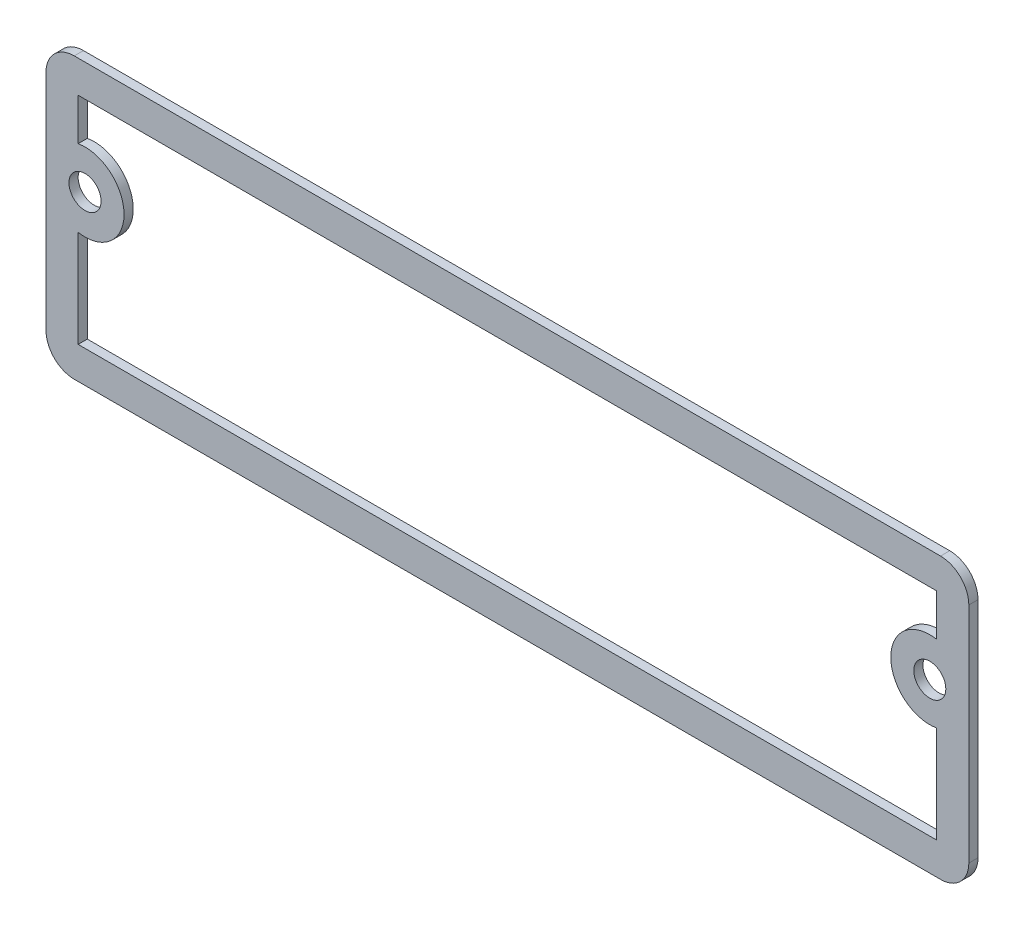
ISO-10303-21;
HEADER;
FILE_DESCRIPTION(('STEP AP214'),'2;1');
FILE_NAME('part.step','',(''),(''),'','','');
FILE_SCHEMA(('AUTOMOTIVE_DESIGN { 1 0 10303 214 1 1 1 1 }'));
ENDSEC;
DATA;
#1=APPLICATION_CONTEXT('core data for automotive mechanical design processes');
#2=APPLICATION_PROTOCOL_DEFINITION('international standard','automotive_design',2000,#1);
#3=PRODUCT_CONTEXT('',#1,'mechanical');
#4=PRODUCT('Part','Part','',(#3));
#5=PRODUCT_RELATED_PRODUCT_CATEGORY('part','',(#4));
#6=PRODUCT_DEFINITION_FORMATION('','',#4);
#7=PRODUCT_DEFINITION_CONTEXT('part definition',#1,'design');
#8=PRODUCT_DEFINITION('design','',#6,#7);
#9=PRODUCT_DEFINITION_SHAPE('','',#8);
#10=(LENGTH_UNIT() NAMED_UNIT(*) SI_UNIT(.MILLI.,.METRE.));
#11=(NAMED_UNIT(*) PLANE_ANGLE_UNIT() SI_UNIT($,.RADIAN.));
#12=(NAMED_UNIT(*) SI_UNIT($,.STERADIAN.) SOLID_ANGLE_UNIT());
#13=UNCERTAINTY_MEASURE_WITH_UNIT(LENGTH_MEASURE(1.E-05),#10,'distance_accuracy_value','');
#14=(GEOMETRIC_REPRESENTATION_CONTEXT(3) GLOBAL_UNCERTAINTY_ASSIGNED_CONTEXT((#13)) GLOBAL_UNIT_ASSIGNED_CONTEXT((#10,
#11,#12)) REPRESENTATION_CONTEXT('',''));
#15=CARTESIAN_POINT('',(0.,0.,0.));
#16=DIRECTION('',(0.,0.,1.));
#17=DIRECTION('',(1.,0.,0.));
#18=AXIS2_PLACEMENT_3D('',#15,#16,#17);
#19=CARTESIAN_POINT('',(-3.,3.,1.));
#20=DIRECTION('',(0.,0.,1.));
#21=DIRECTION('',(1.,0.,0.));
#22=AXIS2_PLACEMENT_3D('',#19,#20,#21);
#23=PLANE('',#22);
#24=CARTESIAN_POINT('',(-96.,18.,1.));
#25=DIRECTION('',(0.,0.,1.));
#26=DIRECTION('',(1.,0.,0.));
#27=AXIS2_PLACEMENT_3D('',#24,#25,#26);
#28=CIRCLE('',#27,1.75);
#29=CARTESIAN_POINT('',(-94.25,18.,1.));
#30=VERTEX_POINT('',#29);
#31=EDGE_CURVE('E11',#30,#30,#28,.T.);
#32=ORIENTED_EDGE('',*,*,#31,.F.);
#33=EDGE_LOOP('',(#32));
#34=FACE_BOUND('',#33,.T.);
#35=CARTESIAN_POINT('',(-4.,18.,1.));
#36=DIRECTION('',(0.,0.,1.));
#37=DIRECTION('',(1.,0.,0.));
#38=AXIS2_PLACEMENT_3D('',#35,#36,#37);
#39=CIRCLE('',#38,1.74409830639486);
#40=CARTESIAN_POINT('',(-2.25590169360514,18.,1.));
#41=VERTEX_POINT('',#40);
#42=EDGE_CURVE('E264',#41,#41,#39,.T.);
#43=ORIENTED_EDGE('',*,*,#42,.F.);
#44=EDGE_LOOP('',(#43));
#45=FACE_BOUND('',#44,.T.);
#46=CARTESIAN_POINT('',(-96.,18.,1.));
#47=DIRECTION('',(0.,0.,-1.));
#48=DIRECTION('',(-1.,0.,0.));
#49=AXIS2_PLACEMENT_3D('',#46,#47,#48);
#50=CIRCLE('',#49,4.25);
#51=CARTESIAN_POINT('',(-96.75,22.1833001326704,1.));
#52=VERTEX_POINT('',#51);
#53=CARTESIAN_POINT('',(-96.75,13.8166998673296,1.));
#54=VERTEX_POINT('',#53);
#55=EDGE_CURVE('E154',#52,#54,#50,.T.);
#56=ORIENTED_EDGE('',*,*,#55,.F.);
#57=DIRECTION('',(0.,-1.,0.));
#58=VECTOR('',#57,1.);
#59=CARTESIAN_POINT('',(-96.75,26.75,1.));
#60=LINE('',#59,#58);
#61=CARTESIAN_POINT('',(-96.75,26.75,1.));
#62=VERTEX_POINT('',#61);
#63=EDGE_CURVE('E160',#62,#52,#60,.T.);
#64=ORIENTED_EDGE('',*,*,#63,.F.);
#65=DIRECTION('',(-1.,0.,0.));
#66=VECTOR('',#65,1.);
#67=CARTESIAN_POINT('',(-96.75,26.75,1.));
#68=LINE('',#67,#66);
#69=CARTESIAN_POINT('',(-3.25,26.75,1.));
#70=VERTEX_POINT('',#69);
#71=EDGE_CURVE('E179',#70,#62,#68,.T.);
#72=ORIENTED_EDGE('',*,*,#71,.F.);
#73=DIRECTION('',(0.,1.,0.));
#74=VECTOR('',#73,1.);
#75=CARTESIAN_POINT('',(-3.25,26.75,1.));
#76=LINE('',#75,#74);
#77=CARTESIAN_POINT('',(-3.25,22.1833001326704,1.));
#78=VERTEX_POINT('',#77);
#79=EDGE_CURVE('E176',#78,#70,#76,.T.);
#80=ORIENTED_EDGE('',*,*,#79,.F.);
#81=CARTESIAN_POINT('',(-4.,18.,1.));
#82=DIRECTION('',(0.,0.,-1.));
#83=DIRECTION('',(1.,0.,0.));
#84=AXIS2_PLACEMENT_3D('',#81,#82,#83);
#85=CIRCLE('',#84,4.25);
#86=CARTESIAN_POINT('',(-3.25,13.8166998673296,1.));
#87=VERTEX_POINT('',#86);
#88=EDGE_CURVE('E173',#87,#78,#85,.T.);
#89=ORIENTED_EDGE('',*,*,#88,.F.);
#90=DIRECTION('',(0.,1.,0.));
#91=VECTOR('',#90,1.);
#92=CARTESIAN_POINT('',(-3.25,13.8166998673296,1.));
#93=LINE('',#92,#91);
#94=CARTESIAN_POINT('',(-3.25,3.25,1.));
#95=VERTEX_POINT('',#94);
#96=EDGE_CURVE('E167',#95,#87,#93,.T.);
#97=ORIENTED_EDGE('',*,*,#96,.F.);
#98=DIRECTION('',(1.,0.,0.));
#99=VECTOR('',#98,1.);
#100=CARTESIAN_POINT('',(-96.75,3.25,1.));
#101=LINE('',#100,#99);
#102=CARTESIAN_POINT('',(-96.75,3.25,1.));
#103=VERTEX_POINT('',#102);
#104=EDGE_CURVE('E165',#103,#95,#101,.T.);
#105=ORIENTED_EDGE('',*,*,#104,.F.);
#106=DIRECTION('',(0.,-1.,0.));
#107=VECTOR('',#106,1.);
#108=CARTESIAN_POINT('',(-96.75,13.8166998673296,1.));
#109=LINE('',#108,#107);
#110=EDGE_CURVE('E147',#54,#103,#109,.T.);
#111=ORIENTED_EDGE('',*,*,#110,.F.);
#112=EDGE_LOOP('',(#56,#64,#72,#80,#89,#97,#105,#111));
#113=FACE_BOUND('',#112,.T.);
#114=CARTESIAN_POINT('',(-2.82845920577944,27.1715407942206,1.));
#115=DIRECTION('',(0.,0.,1.));
#116=DIRECTION('',(-1.,0.,0.));
#117=AXIS2_PLACEMENT_3D('',#114,#115,#116);
#118=CIRCLE('',#117,3.07845920577944);
#119=CARTESIAN_POINT('',(0.249999999999999,27.1715407942206,1.));
#120=VERTEX_POINT('',#119);
#121=CARTESIAN_POINT('',(-2.82845920577944,30.25,1.));
#122=VERTEX_POINT('',#121);
#123=EDGE_CURVE('E184',#120,#122,#118,.T.);
#124=ORIENTED_EDGE('',*,*,#123,.T.);
#125=DIRECTION('',(-1.,0.,0.));
#126=VECTOR('',#125,1.);
#127=CARTESIAN_POINT('',(-97.1715407942206,30.25,1.));
#128=LINE('',#127,#126);
#129=CARTESIAN_POINT('',(-97.1715407942206,30.25,1.));
#130=VERTEX_POINT('',#129);
#131=EDGE_CURVE('E197',#122,#130,#128,.T.);
#132=ORIENTED_EDGE('',*,*,#131,.T.);
#133=CARTESIAN_POINT('',(-97.1715407942206,27.1715407942206,1.));
#134=DIRECTION('',(0.,0.,1.));
#135=DIRECTION('',(-1.,0.,0.));
#136=AXIS2_PLACEMENT_3D('',#133,#134,#135);
#137=CIRCLE('',#136,3.07845920577944);
#138=CARTESIAN_POINT('',(-100.25,27.1715407942206,1.));
#139=VERTEX_POINT('',#138);
#140=EDGE_CURVE('E200',#130,#139,#137,.T.);
#141=ORIENTED_EDGE('',*,*,#140,.T.);
#142=DIRECTION('',(0.,-1.,0.));
#143=VECTOR('',#142,1.);
#144=CARTESIAN_POINT('',(-100.25,27.1715407942206,1.));
#145=LINE('',#144,#143);
#146=CARTESIAN_POINT('',(-100.25,2.82845920577944,1.));
#147=VERTEX_POINT('',#146);
#148=EDGE_CURVE('E203',#139,#147,#145,.T.);
#149=ORIENTED_EDGE('',*,*,#148,.T.);
#150=CARTESIAN_POINT('',(-97.1715407942206,2.82845920577944,1.));
#151=DIRECTION('',(0.,0.,1.));
#152=DIRECTION('',(-1.,0.,0.));
#153=AXIS2_PLACEMENT_3D('',#150,#151,#152);
#154=CIRCLE('',#153,3.07845920577944);
#155=CARTESIAN_POINT('',(-97.1715407942206,-0.250000000000003,1.));
#156=VERTEX_POINT('',#155);
#157=EDGE_CURVE('E206',#147,#156,#154,.T.);
#158=ORIENTED_EDGE('',*,*,#157,.T.);
#159=DIRECTION('',(1.,0.,0.));
#160=VECTOR('',#159,1.);
#161=CARTESIAN_POINT('',(-97.1715407942206,-0.250000000000002,1.));
#162=LINE('',#161,#160);
#163=CARTESIAN_POINT('',(-2.82845920577944,-0.250000000000002,1.));
#164=VERTEX_POINT('',#163);
#165=EDGE_CURVE('E209',#156,#164,#162,.T.);
#166=ORIENTED_EDGE('',*,*,#165,.T.);
#167=CARTESIAN_POINT('',(-2.82845920577944,2.82845920577944,1.));
#168=DIRECTION('',(0.,0.,1.));
#169=DIRECTION('',(1.,0.,0.));
#170=AXIS2_PLACEMENT_3D('',#167,#168,#169);
#171=CIRCLE('',#170,3.07845920577944);
#172=CARTESIAN_POINT('',(0.249999999999999,2.82845920577944,1.));
#173=VERTEX_POINT('',#172);
#174=EDGE_CURVE('E212',#164,#173,#171,.T.);
#175=ORIENTED_EDGE('',*,*,#174,.T.);
#176=DIRECTION('',(0.,1.,0.));
#177=VECTOR('',#176,1.);
#178=CARTESIAN_POINT('',(0.249999999999999,27.1715407942206,1.));
#179=LINE('',#178,#177);
#180=EDGE_CURVE('E215',#173,#120,#179,.T.);
#181=ORIENTED_EDGE('',*,*,#180,.T.);
#182=EDGE_LOOP('',(#124,#132,#141,#149,#158,#166,#175,#181));
#183=FACE_BOUND('',#182,.T.);
#184=ADVANCED_FACE('F32',(#34,#45,#113,#183),#23,.T.);
#185=CARTESIAN_POINT('',(-3.,3.,0.));
#186=DIRECTION('',(0.,0.,1.));
#187=DIRECTION('',(1.,0.,0.));
#188=AXIS2_PLACEMENT_3D('',#185,#186,#187);
#189=PLANE('',#188);
#190=CARTESIAN_POINT('',(-96.,18.,0.));
#191=DIRECTION('',(0.,0.,1.));
#192=DIRECTION('',(1.,0.,0.));
#193=AXIS2_PLACEMENT_3D('',#190,#191,#192);
#194=CIRCLE('',#193,1.75);
#195=CARTESIAN_POINT('',(-94.25,18.,0.));
#196=VERTEX_POINT('',#195);
#197=EDGE_CURVE('E36',#196,#196,#194,.T.);
#198=ORIENTED_EDGE('',*,*,#197,.T.);
#199=EDGE_LOOP('',(#198));
#200=FACE_BOUND('',#199,.T.);
#201=CARTESIAN_POINT('',(-4.,18.,0.));
#202=DIRECTION('',(0.,0.,1.));
#203=DIRECTION('',(1.,0.,0.));
#204=AXIS2_PLACEMENT_3D('',#201,#202,#203);
#205=CIRCLE('',#204,1.74409830639486);
#206=CARTESIAN_POINT('',(-2.25590169360514,18.,0.));
#207=VERTEX_POINT('',#206);
#208=EDGE_CURVE('E234',#207,#207,#205,.F.);
#209=ORIENTED_EDGE('',*,*,#208,.F.);
#210=EDGE_LOOP('',(#209));
#211=FACE_BOUND('',#210,.T.);
#212=CARTESIAN_POINT('',(-96.,18.,0.));
#213=DIRECTION('',(0.,0.,1.));
#214=DIRECTION('',(1.,0.,0.));
#215=AXIS2_PLACEMENT_3D('',#212,#213,#214);
#216=CIRCLE('',#215,4.25);
#217=CARTESIAN_POINT('',(-96.75,13.8166998673296,0.));
#218=VERTEX_POINT('',#217);
#219=CARTESIAN_POINT('',(-96.75,22.1833001326704,0.));
#220=VERTEX_POINT('',#219);
#221=EDGE_CURVE('E47',#218,#220,#216,.T.);
#222=ORIENTED_EDGE('',*,*,#221,.F.);
#223=DIRECTION('',(0.,1.,0.));
#224=VECTOR('',#223,1.);
#225=CARTESIAN_POINT('',(-96.75,13.8166998673296,0.));
#226=LINE('',#225,#224);
#227=CARTESIAN_POINT('',(-96.75,3.25,0.));
#228=VERTEX_POINT('',#227);
#229=EDGE_CURVE('E51',#228,#218,#226,.T.);
#230=ORIENTED_EDGE('',*,*,#229,.F.);
#231=DIRECTION('',(-1.,0.,0.));
#232=VECTOR('',#231,1.);
#233=CARTESIAN_POINT('',(-96.75,3.25,0.));
#234=LINE('',#233,#232);
#235=CARTESIAN_POINT('',(-3.25,3.25,0.));
#236=VERTEX_POINT('',#235);
#237=EDGE_CURVE('E244',#236,#228,#234,.T.);
#238=ORIENTED_EDGE('',*,*,#237,.F.);
#239=DIRECTION('',(0.,-1.,0.));
#240=VECTOR('',#239,1.);
#241=CARTESIAN_POINT('',(-3.25,13.8166998673296,0.));
#242=LINE('',#241,#240);
#243=CARTESIAN_POINT('',(-3.25,13.8166998673296,0.));
#244=VERTEX_POINT('',#243);
#245=EDGE_CURVE('E291',#244,#236,#242,.T.);
#246=ORIENTED_EDGE('',*,*,#245,.F.);
#247=CARTESIAN_POINT('',(-4.,18.,0.));
#248=DIRECTION('',(0.,0.,1.));
#249=DIRECTION('',(1.,0.,0.));
#250=AXIS2_PLACEMENT_3D('',#247,#248,#249);
#251=CIRCLE('',#250,4.25);
#252=CARTESIAN_POINT('',(-3.25,22.1833001326704,0.));
#253=VERTEX_POINT('',#252);
#254=EDGE_CURVE('E296',#253,#244,#251,.T.);
#255=ORIENTED_EDGE('',*,*,#254,.F.);
#256=DIRECTION('',(0.,-1.,0.));
#257=VECTOR('',#256,1.);
#258=CARTESIAN_POINT('',(-3.25,26.75,0.));
#259=LINE('',#258,#257);
#260=CARTESIAN_POINT('',(-3.25,26.75,0.));
#261=VERTEX_POINT('',#260);
#262=EDGE_CURVE('E282',#261,#253,#259,.T.);
#263=ORIENTED_EDGE('',*,*,#262,.F.);
#264=DIRECTION('',(1.,0.,0.));
#265=VECTOR('',#264,1.);
#266=CARTESIAN_POINT('',(-96.75,26.75,0.));
#267=LINE('',#266,#265);
#268=CARTESIAN_POINT('',(-96.75,26.75,0.));
#269=VERTEX_POINT('',#268);
#270=EDGE_CURVE('E277',#269,#261,#267,.T.);
#271=ORIENTED_EDGE('',*,*,#270,.F.);
#272=DIRECTION('',(0.,1.,0.));
#273=VECTOR('',#272,1.);
#274=CARTESIAN_POINT('',(-96.75,26.75,0.));
#275=LINE('',#274,#273);
#276=EDGE_CURVE('E248',#220,#269,#275,.T.);
#277=ORIENTED_EDGE('',*,*,#276,.F.);
#278=EDGE_LOOP('',(#222,#230,#238,#246,#255,#263,#271,#277));
#279=FACE_BOUND('',#278,.T.);
#280=CARTESIAN_POINT('',(-2.82845920577944,27.1715407942206,0.));
#281=DIRECTION('',(0.,0.,1.));
#282=DIRECTION('',(1.,0.,0.));
#283=AXIS2_PLACEMENT_3D('',#280,#281,#282);
#284=CIRCLE('',#283,3.07845920577944);
#285=CARTESIAN_POINT('',(-2.82845920577944,30.25,0.));
#286=VERTEX_POINT('',#285);
#287=CARTESIAN_POINT('',(0.249999999999999,27.1715407942206,0.));
#288=VERTEX_POINT('',#287);
#289=EDGE_CURVE('E262',#286,#288,#284,.F.);
#290=ORIENTED_EDGE('',*,*,#289,.T.);
#291=DIRECTION('',(0.,-1.,0.));
#292=VECTOR('',#291,1.);
#293=CARTESIAN_POINT('',(0.249999999999999,27.1715407942206,0.));
#294=LINE('',#293,#292);
#295=CARTESIAN_POINT('',(0.249999999999999,2.82845920577944,0.));
#296=VERTEX_POINT('',#295);
#297=EDGE_CURVE('E260',#288,#296,#294,.T.);
#298=ORIENTED_EDGE('',*,*,#297,.T.);
#299=CARTESIAN_POINT('',(-2.82845920577944,2.82845920577944,0.));
#300=DIRECTION('',(0.,0.,1.));
#301=DIRECTION('',(1.,0.,0.));
#302=AXIS2_PLACEMENT_3D('',#299,#300,#301);
#303=CIRCLE('',#302,3.07845920577944);
#304=CARTESIAN_POINT('',(-2.82845920577944,-0.250000000000002,0.));
#305=VERTEX_POINT('',#304);
#306=EDGE_CURVE('E258',#296,#305,#303,.F.);
#307=ORIENTED_EDGE('',*,*,#306,.T.);
#308=DIRECTION('',(-1.,0.,0.));
#309=VECTOR('',#308,1.);
#310=CARTESIAN_POINT('',(-97.1715407942206,-0.250000000000002,0.));
#311=LINE('',#310,#309);
#312=CARTESIAN_POINT('',(-97.1715407942206,-0.250000000000003,0.));
#313=VERTEX_POINT('',#312);
#314=EDGE_CURVE('E256',#305,#313,#311,.T.);
#315=ORIENTED_EDGE('',*,*,#314,.T.);
#316=CARTESIAN_POINT('',(-97.1715407942206,2.82845920577944,0.));
#317=DIRECTION('',(0.,0.,1.));
#318=DIRECTION('',(1.,0.,0.));
#319=AXIS2_PLACEMENT_3D('',#316,#317,#318);
#320=CIRCLE('',#319,3.07845920577944);
#321=CARTESIAN_POINT('',(-100.25,2.82845920577944,0.));
#322=VERTEX_POINT('',#321);
#323=EDGE_CURVE('E254',#313,#322,#320,.F.);
#324=ORIENTED_EDGE('',*,*,#323,.T.);
#325=DIRECTION('',(0.,1.,0.));
#326=VECTOR('',#325,1.);
#327=CARTESIAN_POINT('',(-100.25,27.1715407942206,0.));
#328=LINE('',#327,#326);
#329=CARTESIAN_POINT('',(-100.25,27.1715407942206,0.));
#330=VERTEX_POINT('',#329);
#331=EDGE_CURVE('E252',#322,#330,#328,.T.);
#332=ORIENTED_EDGE('',*,*,#331,.T.);
#333=CARTESIAN_POINT('',(-97.1715407942206,27.1715407942206,0.));
#334=DIRECTION('',(0.,0.,1.));
#335=DIRECTION('',(1.,0.,0.));
#336=AXIS2_PLACEMENT_3D('',#333,#334,#335);
#337=CIRCLE('',#336,3.07845920577944);
#338=CARTESIAN_POINT('',(-97.1715407942206,30.25,0.));
#339=VERTEX_POINT('',#338);
#340=EDGE_CURVE('E250',#330,#339,#337,.F.);
#341=ORIENTED_EDGE('',*,*,#340,.T.);
#342=DIRECTION('',(1.,0.,0.));
#343=VECTOR('',#342,1.);
#344=CARTESIAN_POINT('',(-97.1715407942206,30.25,0.));
#345=LINE('',#344,#343);
#346=EDGE_CURVE('E236',#339,#286,#345,.T.);
#347=ORIENTED_EDGE('',*,*,#346,.T.);
#348=EDGE_LOOP('',(#290,#298,#307,#315,#324,#332,#341,#347));
#349=FACE_BOUND('',#348,.T.);
#350=ADVANCED_FACE('F34',(#200,#211,#279,#349),#189,.F.);
#351=CARTESIAN_POINT('',(-96.,18.,1.));
#352=DIRECTION('',(0.,0.,-1.));
#353=DIRECTION('',(-1.,0.,0.));
#354=AXIS2_PLACEMENT_3D('',#351,#352,#353);
#355=CYLINDRICAL_SURFACE('',#354,1.75);
#356=ORIENTED_EDGE('',*,*,#31,.T.);
#357=EDGE_LOOP('',(#356));
#358=FACE_BOUND('',#357,.T.);
#359=ORIENTED_EDGE('',*,*,#197,.F.);
#360=EDGE_LOOP('',(#359));
#361=FACE_BOUND('',#360,.T.);
#362=ADVANCED_FACE('F302',(#358,#361),#355,.F.);
#363=CARTESIAN_POINT('',(-4.,18.,-105.026187210619));
#364=DIRECTION('',(0.,0.,1.));
#365=DIRECTION('',(1.,0.,0.));
#366=AXIS2_PLACEMENT_3D('',#363,#364,#365);
#367=CYLINDRICAL_SURFACE('',#366,1.74409830639486);
#368=ORIENTED_EDGE('',*,*,#208,.T.);
#369=EDGE_LOOP('',(#368));
#370=FACE_BOUND('',#369,.T.);
#371=ORIENTED_EDGE('',*,*,#42,.T.);
#372=EDGE_LOOP('',(#371));
#373=FACE_BOUND('',#372,.T.);
#374=ADVANCED_FACE('F359',(#370,#373),#367,.F.);
#375=CARTESIAN_POINT('',(-96.75,26.75,-105.026187210619));
#376=DIRECTION('',(-1.,0.,0.));
#377=DIRECTION('',(0.,0.,1.));
#378=AXIS2_PLACEMENT_3D('',#375,#376,#377);
#379=PLANE('',#378);
#380=DIRECTION('',(0.,0.,1.));
#381=VECTOR('',#380,1.);
#382=CARTESIAN_POINT('',(-96.75,22.1833001326704,-105.026187210619));
#383=LINE('',#382,#381);
#384=EDGE_CURVE('E151',#220,#52,#383,.T.);
#385=ORIENTED_EDGE('',*,*,#384,.F.);
#386=ORIENTED_EDGE('',*,*,#276,.T.);
#387=DIRECTION('',(0.,0.,1.));
#388=VECTOR('',#387,1.);
#389=CARTESIAN_POINT('',(-96.75,26.75,-105.026187210619));
#390=LINE('',#389,#388);
#391=EDGE_CURVE('E182',#269,#62,#390,.T.);
#392=ORIENTED_EDGE('',*,*,#391,.T.);
#393=ORIENTED_EDGE('',*,*,#63,.T.);
#394=EDGE_LOOP('',(#385,#386,#392,#393));
#395=FACE_BOUND('',#394,.T.);
#396=ADVANCED_FACE('F267',(#395),#379,.F.);
#397=CARTESIAN_POINT('',(-96.75,26.75,-105.026187210619));
#398=DIRECTION('',(0.,1.,0.));
#399=DIRECTION('',(0.,0.,1.));
#400=AXIS2_PLACEMENT_3D('',#397,#398,#399);
#401=PLANE('',#400);
#402=ORIENTED_EDGE('',*,*,#391,.F.);
#403=ORIENTED_EDGE('',*,*,#270,.T.);
#404=DIRECTION('',(0.,0.,1.));
#405=VECTOR('',#404,1.);
#406=CARTESIAN_POINT('',(-3.25,26.75,-105.026187210619));
#407=LINE('',#406,#405);
#408=EDGE_CURVE('E185',#261,#70,#407,.T.);
#409=ORIENTED_EDGE('',*,*,#408,.T.);
#410=ORIENTED_EDGE('',*,*,#71,.T.);
#411=EDGE_LOOP('',(#402,#403,#409,#410));
#412=FACE_BOUND('',#411,.T.);
#413=ADVANCED_FACE('F274',(#412),#401,.F.);
#414=CARTESIAN_POINT('',(-3.25,26.75,-105.026187210619));
#415=DIRECTION('',(1.,0.,0.));
#416=DIRECTION('',(0.,0.,-1.));
#417=AXIS2_PLACEMENT_3D('',#414,#415,#416);
#418=PLANE('',#417);
#419=ORIENTED_EDGE('',*,*,#408,.F.);
#420=ORIENTED_EDGE('',*,*,#262,.T.);
#421=DIRECTION('',(0.,0.,1.));
#422=VECTOR('',#421,1.);
#423=CARTESIAN_POINT('',(-3.25,22.1833001326704,-105.026187210619));
#424=LINE('',#423,#422);
#425=EDGE_CURVE('E187',#253,#78,#424,.T.);
#426=ORIENTED_EDGE('',*,*,#425,.T.);
#427=ORIENTED_EDGE('',*,*,#79,.T.);
#428=EDGE_LOOP('',(#419,#420,#426,#427));
#429=FACE_BOUND('',#428,.T.);
#430=ADVANCED_FACE('F280',(#429),#418,.F.);
#431=CARTESIAN_POINT('',(-4.,18.,-105.026187210619));
#432=DIRECTION('',(0.,0.,1.));
#433=DIRECTION('',(1.,0.,0.));
#434=AXIS2_PLACEMENT_3D('',#431,#432,#433);
#435=CYLINDRICAL_SURFACE('',#434,4.25);
#436=ORIENTED_EDGE('',*,*,#425,.F.);
#437=ORIENTED_EDGE('',*,*,#254,.T.);
#438=DIRECTION('',(0.,0.,1.));
#439=VECTOR('',#438,1.);
#440=CARTESIAN_POINT('',(-3.25,13.8166998673296,-105.026187210619));
#441=LINE('',#440,#439);
#442=EDGE_CURVE('E189',#244,#87,#441,.T.);
#443=ORIENTED_EDGE('',*,*,#442,.T.);
#444=ORIENTED_EDGE('',*,*,#88,.T.);
#445=EDGE_LOOP('',(#436,#437,#443,#444));
#446=FACE_BOUND('',#445,.T.);
#447=ADVANCED_FACE('F285',(#446),#435,.T.);
#448=CARTESIAN_POINT('',(-3.25,13.8166998673296,-105.026187210619));
#449=DIRECTION('',(1.,0.,0.));
#450=DIRECTION('',(0.,1.,0.));
#451=AXIS2_PLACEMENT_3D('',#448,#449,#450);
#452=PLANE('',#451);
#453=ORIENTED_EDGE('',*,*,#442,.F.);
#454=ORIENTED_EDGE('',*,*,#245,.T.);
#455=DIRECTION('',(0.,0.,1.));
#456=VECTOR('',#455,1.);
#457=CARTESIAN_POINT('',(-3.25,3.25,-105.026187210619));
#458=LINE('',#457,#456);
#459=EDGE_CURVE('E191',#236,#95,#458,.T.);
#460=ORIENTED_EDGE('',*,*,#459,.T.);
#461=ORIENTED_EDGE('',*,*,#96,.T.);
#462=EDGE_LOOP('',(#453,#454,#460,#461));
#463=FACE_BOUND('',#462,.T.);
#464=ADVANCED_FACE('F288',(#463),#452,.F.);
#465=CARTESIAN_POINT('',(-96.75,3.25,-105.026187210619));
#466=DIRECTION('',(0.,-1.,0.));
#467=DIRECTION('',(0.,0.,-1.));
#468=AXIS2_PLACEMENT_3D('',#465,#466,#467);
#469=PLANE('',#468);
#470=ORIENTED_EDGE('',*,*,#459,.F.);
#471=ORIENTED_EDGE('',*,*,#237,.T.);
#472=DIRECTION('',(0.,0.,1.));
#473=VECTOR('',#472,1.);
#474=CARTESIAN_POINT('',(-96.75,3.25,-105.026187210619));
#475=LINE('',#474,#473);
#476=EDGE_CURVE('E150',#228,#103,#475,.T.);
#477=ORIENTED_EDGE('',*,*,#476,.T.);
#478=ORIENTED_EDGE('',*,*,#104,.T.);
#479=EDGE_LOOP('',(#470,#471,#477,#478));
#480=FACE_BOUND('',#479,.T.);
#481=ADVANCED_FACE('F294',(#480),#469,.F.);
#482=CARTESIAN_POINT('',(-96.75,13.8166998673296,-105.026187210619));
#483=DIRECTION('',(-1.,0.,0.));
#484=DIRECTION('',(0.,0.,1.));
#485=AXIS2_PLACEMENT_3D('',#482,#483,#484);
#486=PLANE('',#485);
#487=ORIENTED_EDGE('',*,*,#476,.F.);
#488=ORIENTED_EDGE('',*,*,#229,.T.);
#489=DIRECTION('',(0.,0.,1.));
#490=VECTOR('',#489,1.);
#491=CARTESIAN_POINT('',(-96.75,13.8166998673296,-105.026187210619));
#492=LINE('',#491,#490);
#493=EDGE_CURVE('E143',#218,#54,#492,.T.);
#494=ORIENTED_EDGE('',*,*,#493,.T.);
#495=ORIENTED_EDGE('',*,*,#110,.T.);
#496=EDGE_LOOP('',(#487,#488,#494,#495));
#497=FACE_BOUND('',#496,.T.);
#498=ADVANCED_FACE('F145',(#497),#486,.F.);
#499=CARTESIAN_POINT('',(-96.,18.,-105.026187210619));
#500=DIRECTION('',(0.,0.,1.));
#501=DIRECTION('',(1.,0.,0.));
#502=AXIS2_PLACEMENT_3D('',#499,#500,#501);
#503=CYLINDRICAL_SURFACE('',#502,4.25);
#504=ORIENTED_EDGE('',*,*,#493,.F.);
#505=ORIENTED_EDGE('',*,*,#221,.T.);
#506=ORIENTED_EDGE('',*,*,#384,.T.);
#507=ORIENTED_EDGE('',*,*,#55,.T.);
#508=EDGE_LOOP('',(#504,#505,#506,#507));
#509=FACE_BOUND('',#508,.T.);
#510=ADVANCED_FACE('F155',(#509),#503,.T.);
#511=CARTESIAN_POINT('',(-97.1715407942206,30.25,-105.026187210619));
#512=DIRECTION('',(0.,1.,0.));
#513=DIRECTION('',(0.,0.,1.));
#514=AXIS2_PLACEMENT_3D('',#511,#512,#513);
#515=PLANE('',#514);
#516=ORIENTED_EDGE('',*,*,#346,.F.);
#517=DIRECTION('',(0.,0.,1.));
#518=VECTOR('',#517,1.);
#519=CARTESIAN_POINT('',(-97.1715407942206,30.25,-105.026187210619));
#520=LINE('',#519,#518);
#521=EDGE_CURVE('E231',#339,#130,#520,.T.);
#522=ORIENTED_EDGE('',*,*,#521,.T.);
#523=ORIENTED_EDGE('',*,*,#131,.F.);
#524=DIRECTION('',(0.,0.,1.));
#525=VECTOR('',#524,1.);
#526=CARTESIAN_POINT('',(-2.82845920577944,30.25,-105.026187210619));
#527=LINE('',#526,#525);
#528=EDGE_CURVE('E218',#286,#122,#527,.T.);
#529=ORIENTED_EDGE('',*,*,#528,.F.);
#530=EDGE_LOOP('',(#516,#522,#523,#529));
#531=FACE_BOUND('',#530,.T.);
#532=ADVANCED_FACE('F341',(#531),#515,.T.);
#533=CARTESIAN_POINT('',(-97.1715407942206,27.1715407942206,-105.026187210619));
#534=DIRECTION('',(0.,0.,1.));
#535=DIRECTION('',(1.,0.,0.));
#536=AXIS2_PLACEMENT_3D('',#533,#534,#535);
#537=CYLINDRICAL_SURFACE('',#536,3.07845920577944);
#538=ORIENTED_EDGE('',*,*,#340,.F.);
#539=DIRECTION('',(0.,0.,1.));
#540=VECTOR('',#539,1.);
#541=CARTESIAN_POINT('',(-100.25,27.1715407942206,-105.026187210619));
#542=LINE('',#541,#540);
#543=EDGE_CURVE('E229',#330,#139,#542,.T.);
#544=ORIENTED_EDGE('',*,*,#543,.T.);
#545=ORIENTED_EDGE('',*,*,#140,.F.);
#546=ORIENTED_EDGE('',*,*,#521,.F.);
#547=EDGE_LOOP('',(#538,#544,#545,#546));
#548=FACE_BOUND('',#547,.T.);
#549=ADVANCED_FACE('F338',(#548),#537,.T.);
#550=CARTESIAN_POINT('',(-100.25,27.1715407942206,-105.026187210619));
#551=DIRECTION('',(-1.,0.,0.));
#552=DIRECTION('',(0.,0.,1.));
#553=AXIS2_PLACEMENT_3D('',#550,#551,#552);
#554=PLANE('',#553);
#555=ORIENTED_EDGE('',*,*,#331,.F.);
#556=DIRECTION('',(0.,0.,1.));
#557=VECTOR('',#556,1.);
#558=CARTESIAN_POINT('',(-100.25,2.82845920577944,-105.026187210619));
#559=LINE('',#558,#557);
#560=EDGE_CURVE('E227',#322,#147,#559,.T.);
#561=ORIENTED_EDGE('',*,*,#560,.T.);
#562=ORIENTED_EDGE('',*,*,#148,.F.);
#563=ORIENTED_EDGE('',*,*,#543,.F.);
#564=EDGE_LOOP('',(#555,#561,#562,#563));
#565=FACE_BOUND('',#564,.T.);
#566=ADVANCED_FACE('F334',(#565),#554,.T.);
#567=CARTESIAN_POINT('',(-97.1715407942206,2.82845920577944,-105.026187210619));
#568=DIRECTION('',(0.,0.,1.));
#569=DIRECTION('',(1.,0.,0.));
#570=AXIS2_PLACEMENT_3D('',#567,#568,#569);
#571=CYLINDRICAL_SURFACE('',#570,3.07845920577944);
#572=ORIENTED_EDGE('',*,*,#323,.F.);
#573=DIRECTION('',(0.,0.,1.));
#574=VECTOR('',#573,1.);
#575=CARTESIAN_POINT('',(-97.1715407942206,-0.250000000000003,-105.026187210619));
#576=LINE('',#575,#574);
#577=EDGE_CURVE('E225',#313,#156,#576,.T.);
#578=ORIENTED_EDGE('',*,*,#577,.T.);
#579=ORIENTED_EDGE('',*,*,#157,.F.);
#580=ORIENTED_EDGE('',*,*,#560,.F.);
#581=EDGE_LOOP('',(#572,#578,#579,#580));
#582=FACE_BOUND('',#581,.T.);
#583=ADVANCED_FACE('F328',(#582),#571,.T.);
#584=CARTESIAN_POINT('',(-97.1715407942206,-0.250000000000002,-105.026187210619));
#585=DIRECTION('',(0.,-1.,0.));
#586=DIRECTION('',(0.,0.,-1.));
#587=AXIS2_PLACEMENT_3D('',#584,#585,#586);
#588=PLANE('',#587);
#589=ORIENTED_EDGE('',*,*,#314,.F.);
#590=DIRECTION('',(0.,0.,1.));
#591=VECTOR('',#590,1.);
#592=CARTESIAN_POINT('',(-2.82845920577944,-0.250000000000002,-105.026187210619));
#593=LINE('',#592,#591);
#594=EDGE_CURVE('E223',#305,#164,#593,.T.);
#595=ORIENTED_EDGE('',*,*,#594,.T.);
#596=ORIENTED_EDGE('',*,*,#165,.F.);
#597=ORIENTED_EDGE('',*,*,#577,.F.);
#598=EDGE_LOOP('',(#589,#595,#596,#597));
#599=FACE_BOUND('',#598,.T.);
#600=ADVANCED_FACE('F325',(#599),#588,.T.);
#601=CARTESIAN_POINT('',(-2.82845920577944,2.82845920577944,-105.026187210619));
#602=DIRECTION('',(0.,0.,1.));
#603=DIRECTION('',(1.,0.,0.));
#604=AXIS2_PLACEMENT_3D('',#601,#602,#603);
#605=CYLINDRICAL_SURFACE('',#604,3.07845920577944);
#606=ORIENTED_EDGE('',*,*,#306,.F.);
#607=DIRECTION('',(0.,0.,1.));
#608=VECTOR('',#607,1.);
#609=CARTESIAN_POINT('',(0.249999999999999,2.82845920577944,-105.026187210619));
#610=LINE('',#609,#608);
#611=EDGE_CURVE('E221',#296,#173,#610,.T.);
#612=ORIENTED_EDGE('',*,*,#611,.T.);
#613=ORIENTED_EDGE('',*,*,#174,.F.);
#614=ORIENTED_EDGE('',*,*,#594,.F.);
#615=EDGE_LOOP('',(#606,#612,#613,#614));
#616=FACE_BOUND('',#615,.T.);
#617=ADVANCED_FACE('F320',(#616),#605,.T.);
#618=CARTESIAN_POINT('',(0.249999999999999,27.1715407942206,-105.026187210619));
#619=DIRECTION('',(1.,0.,0.));
#620=DIRECTION('',(0.,1.,0.));
#621=AXIS2_PLACEMENT_3D('',#618,#619,#620);
#622=PLANE('',#621);
#623=ORIENTED_EDGE('',*,*,#297,.F.);
#624=DIRECTION('',(0.,0.,1.));
#625=VECTOR('',#624,1.);
#626=CARTESIAN_POINT('',(0.249999999999999,27.1715407942206,-105.026187210619));
#627=LINE('',#626,#625);
#628=EDGE_CURVE('E219',#288,#120,#627,.T.);
#629=ORIENTED_EDGE('',*,*,#628,.T.);
#630=ORIENTED_EDGE('',*,*,#180,.F.);
#631=ORIENTED_EDGE('',*,*,#611,.F.);
#632=EDGE_LOOP('',(#623,#629,#630,#631));
#633=FACE_BOUND('',#632,.T.);
#634=ADVANCED_FACE('F311',(#633),#622,.T.);
#635=CARTESIAN_POINT('',(-2.82845920577944,27.1715407942206,-105.026187210619));
#636=DIRECTION('',(0.,0.,1.));
#637=DIRECTION('',(1.,0.,0.));
#638=AXIS2_PLACEMENT_3D('',#635,#636,#637);
#639=CYLINDRICAL_SURFACE('',#638,3.07845920577944);
#640=ORIENTED_EDGE('',*,*,#289,.F.);
#641=ORIENTED_EDGE('',*,*,#528,.T.);
#642=ORIENTED_EDGE('',*,*,#123,.F.);
#643=ORIENTED_EDGE('',*,*,#628,.F.);
#644=EDGE_LOOP('',(#640,#641,#642,#643));
#645=FACE_BOUND('',#644,.T.);
#646=ADVANCED_FACE('F314',(#645),#639,.T.);
#647=CLOSED_SHELL('',(#184,#350,#362,#374,#396,#413,#430,#447,#464,#481,#498,#510,#532,#549,
#566,#583,#600,#617,#634,#646));
#648=MANIFOLD_SOLID_BREP('B2',#647);
#649=ADVANCED_BREP_SHAPE_REPRESENTATION('',(#18,#648),#14);
#650=SHAPE_DEFINITION_REPRESENTATION(#9,#649);
ENDSEC;
END-ISO-10303-21;
